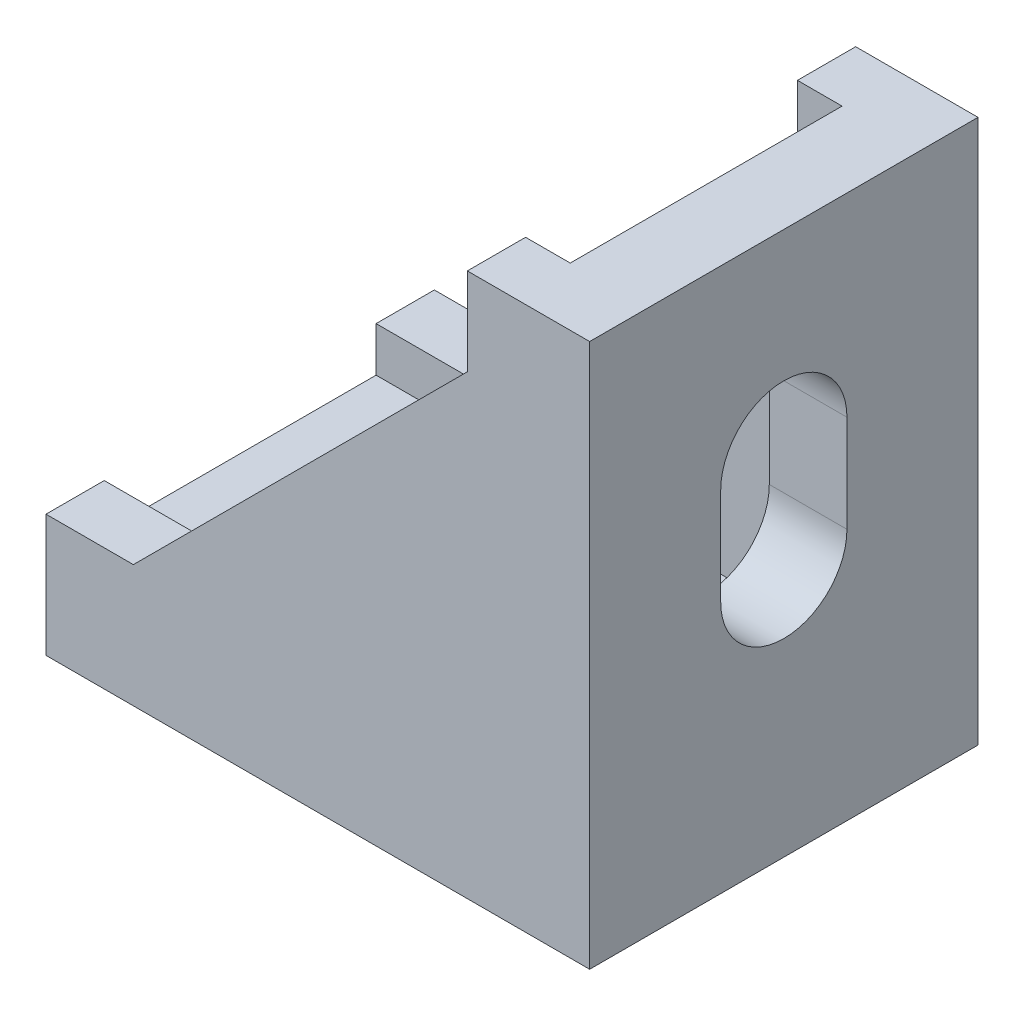
ISO-10303-21;
HEADER;
FILE_DESCRIPTION(('STEP AP214'),'2;1');
FILE_NAME('part.step','',(''),(''),'','','');
FILE_SCHEMA(('AUTOMOTIVE_DESIGN { 1 0 10303 214 1 1 1 1 }'));
ENDSEC;
DATA;
#1=APPLICATION_CONTEXT('core data for automotive mechanical design processes');
#2=APPLICATION_PROTOCOL_DEFINITION('international standard','automotive_design',2000,#1);
#3=PRODUCT_CONTEXT('',#1,'mechanical');
#4=PRODUCT('Part','Part','',(#3));
#5=PRODUCT_RELATED_PRODUCT_CATEGORY('part','',(#4));
#6=PRODUCT_DEFINITION_FORMATION('','',#4);
#7=PRODUCT_DEFINITION_CONTEXT('part definition',#1,'design');
#8=PRODUCT_DEFINITION('design','',#6,#7);
#9=PRODUCT_DEFINITION_SHAPE('','',#8);
#10=(LENGTH_UNIT() NAMED_UNIT(*) SI_UNIT(.MILLI.,.METRE.));
#11=(NAMED_UNIT(*) PLANE_ANGLE_UNIT() SI_UNIT($,.RADIAN.));
#12=(NAMED_UNIT(*) SI_UNIT($,.STERADIAN.) SOLID_ANGLE_UNIT());
#13=UNCERTAINTY_MEASURE_WITH_UNIT(LENGTH_MEASURE(1.E-05),#10,'distance_accuracy_value','');
#14=(GEOMETRIC_REPRESENTATION_CONTEXT(3) GLOBAL_UNCERTAINTY_ASSIGNED_CONTEXT((#13)) GLOBAL_UNIT_ASSIGNED_CONTEXT((#10,
#11,#12)) REPRESENTATION_CONTEXT('',''));
#15=CARTESIAN_POINT('',(0.,0.,0.));
#16=DIRECTION('',(0.,0.,1.));
#17=DIRECTION('',(1.,0.,0.));
#18=AXIS2_PLACEMENT_3D('',#15,#16,#17);
#19=CARTESIAN_POINT('',(10.,14.,20.));
#20=DIRECTION('',(1.,0.,0.));
#21=DIRECTION('',(0.,1.,0.));
#22=AXIS2_PLACEMENT_3D('',#19,#20,#21);
#23=PLANE('',#22);
#24=DIRECTION('',(0.,-1.,0.));
#25=VECTOR('',#24,1.);
#26=CARTESIAN_POINT('',(10.,4.00000000000001,6.75));
#27=LINE('',#26,#25);
#28=CARTESIAN_POINT('',(10.,4.00000000000001,6.75));
#29=VERTEX_POINT('',#28);
#30=CARTESIAN_POINT('',(10.,-0.999999999999995,6.75));
#31=VERTEX_POINT('',#30);
#32=EDGE_CURVE('E257',#29,#31,#27,.T.);
#33=ORIENTED_EDGE('',*,*,#32,.F.);
#34=CARTESIAN_POINT('',(10.,4.,10.));
#35=DIRECTION('',(-1.,0.,0.));
#36=DIRECTION('',(0.,-1.,0.));
#37=AXIS2_PLACEMENT_3D('',#34,#35,#36);
#38=CIRCLE('',#37,3.25);
#39=CARTESIAN_POINT('',(10.,4.,13.25));
#40=VERTEX_POINT('',#39);
#41=EDGE_CURVE('E231',#40,#29,#38,.T.);
#42=ORIENTED_EDGE('',*,*,#41,.F.);
#43=DIRECTION('',(0.,1.,0.));
#44=VECTOR('',#43,1.);
#45=CARTESIAN_POINT('',(10.,4.,13.25));
#46=LINE('',#45,#44);
#47=CARTESIAN_POINT('',(10.,-0.999999999999995,13.25));
#48=VERTEX_POINT('',#47);
#49=EDGE_CURVE('E242',#48,#40,#46,.T.);
#50=ORIENTED_EDGE('',*,*,#49,.F.);
#51=CARTESIAN_POINT('',(10.,-0.999999999999996,10.));
#52=DIRECTION('',(-1.,0.,0.));
#53=DIRECTION('',(0.,-1.,0.));
#54=AXIS2_PLACEMENT_3D('',#51,#52,#53);
#55=CIRCLE('',#54,3.25);
#56=EDGE_CURVE('E261',#31,#48,#55,.T.);
#57=ORIENTED_EDGE('',*,*,#56,.F.);
#58=EDGE_LOOP('',(#33,#42,#50,#57));
#59=FACE_BOUND('',#58,.T.);
#60=DIRECTION('',(0.,-1.,0.));
#61=VECTOR('',#60,1.);
#62=CARTESIAN_POINT('',(10.,14.,17.));
#63=LINE('',#62,#61);
#64=CARTESIAN_POINT('',(10.,14.,17.));
#65=VERTEX_POINT('',#64);
#66=CARTESIAN_POINT('',(10.,-10.,17.));
#67=VERTEX_POINT('',#66);
#68=EDGE_CURVE('E325',#65,#67,#63,.T.);
#69=ORIENTED_EDGE('',*,*,#68,.F.);
#70=DIRECTION('',(0.,0.,-1.));
#71=VECTOR('',#70,1.);
#72=CARTESIAN_POINT('',(10.,14.,20.));
#73=LINE('',#72,#71);
#74=CARTESIAN_POINT('',(10.,14.,3.));
#75=VERTEX_POINT('',#74);
#76=EDGE_CURVE('E48',#65,#75,#73,.T.);
#77=ORIENTED_EDGE('',*,*,#76,.T.);
#78=DIRECTION('',(0.,1.,0.));
#79=VECTOR('',#78,1.);
#80=CARTESIAN_POINT('',(10.,14.,3.));
#81=LINE('',#80,#79);
#82=CARTESIAN_POINT('',(10.,-10.,3.));
#83=VERTEX_POINT('',#82);
#84=EDGE_CURVE('E377',#83,#75,#81,.T.);
#85=ORIENTED_EDGE('',*,*,#84,.F.);
#86=DIRECTION('',(0.,0.,-1.));
#87=VECTOR('',#86,1.);
#88=CARTESIAN_POINT('',(10.,-10.,20.));
#89=LINE('',#88,#87);
#90=EDGE_CURVE('E418',#67,#83,#89,.T.);
#91=ORIENTED_EDGE('',*,*,#90,.F.);
#92=EDGE_LOOP('',(#69,#77,#85,#91));
#93=FACE_BOUND('',#92,.T.);
#94=ADVANCED_FACE('F39',(#59,#93),#23,.F.);
#95=CARTESIAN_POINT('',(10.,-10.,20.));
#96=DIRECTION('',(0.,-1.,0.));
#97=DIRECTION('',(1.,0.,0.));
#98=AXIS2_PLACEMENT_3D('',#95,#96,#97);
#99=PLANE('',#98);
#100=DIRECTION('',(1.,0.,0.));
#101=VECTOR('',#100,1.);
#102=CARTESIAN_POINT('',(-3.99999999999999,-10.,13.25));
#103=LINE('',#102,#101);
#104=CARTESIAN_POINT('',(-3.99999999999999,-10.,13.25));
#105=VERTEX_POINT('',#104);
#106=CARTESIAN_POINT('',(1.,-10.,13.25));
#107=VERTEX_POINT('',#106);
#108=EDGE_CURVE('E222',#105,#107,#103,.T.);
#109=ORIENTED_EDGE('',*,*,#108,.F.);
#110=CARTESIAN_POINT('',(-3.99999999999999,-10.,10.));
#111=DIRECTION('',(0.,1.,0.));
#112=DIRECTION('',(-1.,0.,0.));
#113=AXIS2_PLACEMENT_3D('',#110,#111,#112);
#114=CIRCLE('',#113,3.25);
#115=CARTESIAN_POINT('',(-3.99999999999999,-10.,6.75));
#116=VERTEX_POINT('',#115);
#117=EDGE_CURVE('E55',#116,#105,#114,.T.);
#118=ORIENTED_EDGE('',*,*,#117,.F.);
#119=DIRECTION('',(-1.,0.,0.));
#120=VECTOR('',#119,1.);
#121=CARTESIAN_POINT('',(-3.99999999999999,-10.,6.75));
#122=LINE('',#121,#120);
#123=CARTESIAN_POINT('',(1.00000000000001,-10.,6.75));
#124=VERTEX_POINT('',#123);
#125=EDGE_CURVE('E209',#124,#116,#122,.T.);
#126=ORIENTED_EDGE('',*,*,#125,.F.);
#127=CARTESIAN_POINT('',(1.00000000000001,-10.,10.));
#128=DIRECTION('',(0.,1.,0.));
#129=DIRECTION('',(-1.,0.,0.));
#130=AXIS2_PLACEMENT_3D('',#127,#128,#129);
#131=CIRCLE('',#130,3.25);
#132=EDGE_CURVE('E213',#107,#124,#131,.T.);
#133=ORIENTED_EDGE('',*,*,#132,.F.);
#134=EDGE_LOOP('',(#109,#118,#126,#133));
#135=FACE_BOUND('',#134,.T.);
#136=DIRECTION('',(-1.,0.,0.));
#137=VECTOR('',#136,1.);
#138=CARTESIAN_POINT('',(10.,-10.,17.));
#139=LINE('',#138,#137);
#140=CARTESIAN_POINT('',(-14.,-10.,17.));
#141=VERTEX_POINT('',#140);
#142=EDGE_CURVE('E311',#67,#141,#139,.T.);
#143=ORIENTED_EDGE('',*,*,#142,.F.);
#144=ORIENTED_EDGE('',*,*,#90,.T.);
#145=DIRECTION('',(1.,0.,0.));
#146=VECTOR('',#145,1.);
#147=CARTESIAN_POINT('',(10.,-10.,3.));
#148=LINE('',#147,#146);
#149=CARTESIAN_POINT('',(-14.,-10.,3.));
#150=VERTEX_POINT('',#149);
#151=EDGE_CURVE('E364',#150,#83,#148,.T.);
#152=ORIENTED_EDGE('',*,*,#151,.F.);
#153=DIRECTION('',(0.,0.,-1.));
#154=VECTOR('',#153,1.);
#155=CARTESIAN_POINT('',(-14.,-10.,20.));
#156=LINE('',#155,#154);
#157=EDGE_CURVE('E415',#141,#150,#156,.T.);
#158=ORIENTED_EDGE('',*,*,#157,.F.);
#159=EDGE_LOOP('',(#143,#144,#152,#158));
#160=FACE_BOUND('',#159,.T.);
#161=ADVANCED_FACE('F454',(#135,#160),#99,.F.);
#162=CARTESIAN_POINT('',(14.,-14.,20.));
#163=DIRECTION('',(-1.,0.,0.));
#164=DIRECTION('',(0.,0.,1.));
#165=AXIS2_PLACEMENT_3D('',#162,#163,#164);
#166=PLANE('',#165);
#167=DIRECTION('',(0.,1.,0.));
#168=VECTOR('',#167,1.);
#169=CARTESIAN_POINT('',(14.,4.,13.25));
#170=LINE('',#169,#168);
#171=CARTESIAN_POINT('',(14.,-0.999999999999994,13.25));
#172=VERTEX_POINT('',#171);
#173=CARTESIAN_POINT('',(14.,4.,13.25));
#174=VERTEX_POINT('',#173);
#175=EDGE_CURVE('E250',#172,#174,#170,.T.);
#176=ORIENTED_EDGE('',*,*,#175,.T.);
#177=CARTESIAN_POINT('',(14.,4.00000000000001,10.));
#178=DIRECTION('',(-1.,0.,0.));
#179=DIRECTION('',(0.,-1.,0.));
#180=AXIS2_PLACEMENT_3D('',#177,#178,#179);
#181=CIRCLE('',#180,3.25);
#182=CARTESIAN_POINT('',(14.,4.00000000000001,6.75));
#183=VERTEX_POINT('',#182);
#184=EDGE_CURVE('E237',#174,#183,#181,.T.);
#185=ORIENTED_EDGE('',*,*,#184,.T.);
#186=DIRECTION('',(0.,-1.,0.));
#187=VECTOR('',#186,1.);
#188=CARTESIAN_POINT('',(14.,4.00000000000001,6.75));
#189=LINE('',#188,#187);
#190=CARTESIAN_POINT('',(14.,-0.999999999999996,6.75));
#191=VERTEX_POINT('',#190);
#192=EDGE_CURVE('E241',#183,#191,#189,.T.);
#193=ORIENTED_EDGE('',*,*,#192,.T.);
#194=CARTESIAN_POINT('',(14.,-0.999999999999995,10.));
#195=DIRECTION('',(-1.,0.,0.));
#196=DIRECTION('',(0.,-1.,0.));
#197=AXIS2_PLACEMENT_3D('',#194,#195,#196);
#198=CIRCLE('',#197,3.25);
#199=EDGE_CURVE('E246',#191,#172,#198,.T.);
#200=ORIENTED_EDGE('',*,*,#199,.T.);
#201=EDGE_LOOP('',(#176,#185,#193,#200));
#202=FACE_BOUND('',#201,.T.);
#203=DIRECTION('',(0.,0.,-1.));
#204=VECTOR('',#203,1.);
#205=CARTESIAN_POINT('',(14.,-14.,20.));
#206=LINE('',#205,#204);
#207=CARTESIAN_POINT('',(14.,-14.,20.));
#208=VERTEX_POINT('',#207);
#209=CARTESIAN_POINT('',(14.,-14.,0.));
#210=VERTEX_POINT('',#209);
#211=EDGE_CURVE('E396',#208,#210,#206,.T.);
#212=ORIENTED_EDGE('',*,*,#211,.T.);
#213=DIRECTION('',(0.,1.,0.));
#214=VECTOR('',#213,1.);
#215=CARTESIAN_POINT('',(14.,-14.,0.));
#216=LINE('',#215,#214);
#217=CARTESIAN_POINT('',(14.,14.,0.));
#218=VERTEX_POINT('',#217);
#219=EDGE_CURVE('E381',#210,#218,#216,.T.);
#220=ORIENTED_EDGE('',*,*,#219,.T.);
#221=DIRECTION('',(0.,0.,-1.));
#222=VECTOR('',#221,1.);
#223=CARTESIAN_POINT('',(14.,14.,20.));
#224=LINE('',#223,#222);
#225=CARTESIAN_POINT('',(14.,14.,20.));
#226=VERTEX_POINT('',#225);
#227=EDGE_CURVE('E11',#226,#218,#224,.T.);
#228=ORIENTED_EDGE('',*,*,#227,.F.);
#229=DIRECTION('',(0.,1.,0.));
#230=VECTOR('',#229,1.);
#231=CARTESIAN_POINT('',(14.,-14.,20.));
#232=LINE('',#231,#230);
#233=EDGE_CURVE('E382',#208,#226,#232,.T.);
#234=ORIENTED_EDGE('',*,*,#233,.F.);
#235=EDGE_LOOP('',(#212,#220,#228,#234));
#236=FACE_BOUND('',#235,.T.);
#237=ADVANCED_FACE('F41',(#202,#236),#166,.F.);
#238=CARTESIAN_POINT('',(14.,14.,20.));
#239=DIRECTION('',(0.,-1.,0.));
#240=DIRECTION('',(1.,0.,0.));
#241=AXIS2_PLACEMENT_3D('',#238,#239,#240);
#242=PLANE('',#241);
#243=ORIENTED_EDGE('',*,*,#227,.T.);
#244=DIRECTION('',(-1.,0.,0.));
#245=VECTOR('',#244,1.);
#246=CARTESIAN_POINT('',(14.,14.,0.));
#247=LINE('',#246,#245);
#248=CARTESIAN_POINT('',(7.7,14.,0.));
#249=VERTEX_POINT('',#248);
#250=EDGE_CURVE('E400',#218,#249,#247,.T.);
#251=ORIENTED_EDGE('',*,*,#250,.T.);
#252=DIRECTION('',(0.,0.,-1.));
#253=VECTOR('',#252,1.);
#254=CARTESIAN_POINT('',(7.7,14.,3.));
#255=LINE('',#254,#253);
#256=CARTESIAN_POINT('',(7.7,14.,3.));
#257=VERTEX_POINT('',#256);
#258=EDGE_CURVE('E360',#257,#249,#255,.T.);
#259=ORIENTED_EDGE('',*,*,#258,.F.);
#260=DIRECTION('',(1.,0.,0.));
#261=VECTOR('',#260,1.);
#262=CARTESIAN_POINT('',(10.,14.,3.));
#263=LINE('',#262,#261);
#264=EDGE_CURVE('E329',#257,#75,#263,.T.);
#265=ORIENTED_EDGE('',*,*,#264,.T.);
#266=ORIENTED_EDGE('',*,*,#76,.F.);
#267=DIRECTION('',(1.,0.,0.));
#268=VECTOR('',#267,1.);
#269=CARTESIAN_POINT('',(10.,14.,17.));
#270=LINE('',#269,#268);
#271=CARTESIAN_POINT('',(7.7,14.,17.));
#272=VERTEX_POINT('',#271);
#273=EDGE_CURVE('E281',#272,#65,#270,.T.);
#274=ORIENTED_EDGE('',*,*,#273,.F.);
#275=DIRECTION('',(0.,0.,1.));
#276=VECTOR('',#275,1.);
#277=CARTESIAN_POINT('',(7.7,14.,17.));
#278=LINE('',#277,#276);
#279=CARTESIAN_POINT('',(7.7,14.,20.));
#280=VERTEX_POINT('',#279);
#281=EDGE_CURVE('E298',#272,#280,#278,.T.);
#282=ORIENTED_EDGE('',*,*,#281,.T.);
#283=DIRECTION('',(-1.,0.,0.));
#284=VECTOR('',#283,1.);
#285=CARTESIAN_POINT('',(14.,14.,20.));
#286=LINE('',#285,#284);
#287=EDGE_CURVE('E386',#226,#280,#286,.T.);
#288=ORIENTED_EDGE('',*,*,#287,.F.);
#289=EDGE_LOOP('',(#243,#251,#259,#265,#266,#274,#282,#288));
#290=FACE_BOUND('',#289,.T.);
#291=ADVANCED_FACE('F433',(#290),#242,.F.);
#292=CARTESIAN_POINT('',(-14.,-14.,20.));
#293=DIRECTION('',(1.,0.,0.));
#294=DIRECTION('',(0.,0.,-1.));
#295=AXIS2_PLACEMENT_3D('',#292,#293,#294);
#296=PLANE('',#295);
#297=DIRECTION('',(0.,-1.,0.));
#298=VECTOR('',#297,1.);
#299=CARTESIAN_POINT('',(-14.,-14.,20.));
#300=LINE('',#299,#298);
#301=CARTESIAN_POINT('',(-14.,-7.7,20.));
#302=VERTEX_POINT('',#301);
#303=CARTESIAN_POINT('',(-14.,-14.,20.));
#304=VERTEX_POINT('',#303);
#305=EDGE_CURVE('E390',#302,#304,#300,.T.);
#306=ORIENTED_EDGE('',*,*,#305,.F.);
#307=DIRECTION('',(0.,0.,1.));
#308=VECTOR('',#307,1.);
#309=CARTESIAN_POINT('',(-14.,-7.7,17.));
#310=LINE('',#309,#308);
#311=CARTESIAN_POINT('',(-14.,-7.7,17.));
#312=VERTEX_POINT('',#311);
#313=EDGE_CURVE('E307',#312,#302,#310,.T.);
#314=ORIENTED_EDGE('',*,*,#313,.F.);
#315=DIRECTION('',(0.,1.,0.));
#316=VECTOR('',#315,1.);
#317=CARTESIAN_POINT('',(-14.,-7.7,17.));
#318=LINE('',#317,#316);
#319=EDGE_CURVE('E295',#141,#312,#318,.T.);
#320=ORIENTED_EDGE('',*,*,#319,.F.);
#321=ORIENTED_EDGE('',*,*,#157,.T.);
#322=DIRECTION('',(0.,1.,0.));
#323=VECTOR('',#322,1.);
#324=CARTESIAN_POINT('',(-14.,-14.,3.));
#325=LINE('',#324,#323);
#326=CARTESIAN_POINT('',(-14.,-7.7,3.));
#327=VERTEX_POINT('',#326);
#328=EDGE_CURVE('E333',#150,#327,#325,.T.);
#329=ORIENTED_EDGE('',*,*,#328,.T.);
#330=DIRECTION('',(0.,0.,-1.));
#331=VECTOR('',#330,1.);
#332=CARTESIAN_POINT('',(-14.,-7.7,3.));
#333=LINE('',#332,#331);
#334=CARTESIAN_POINT('',(-14.,-7.7,0.));
#335=VERTEX_POINT('',#334);
#336=EDGE_CURVE('E349',#327,#335,#333,.T.);
#337=ORIENTED_EDGE('',*,*,#336,.T.);
#338=DIRECTION('',(0.,-1.,0.));
#339=VECTOR('',#338,1.);
#340=CARTESIAN_POINT('',(-14.,-14.,0.));
#341=LINE('',#340,#339);
#342=CARTESIAN_POINT('',(-14.,-14.,0.));
#343=VERTEX_POINT('',#342);
#344=EDGE_CURVE('E403',#335,#343,#341,.T.);
#345=ORIENTED_EDGE('',*,*,#344,.T.);
#346=DIRECTION('',(0.,0.,-1.));
#347=VECTOR('',#346,1.);
#348=CARTESIAN_POINT('',(-14.,-14.,20.));
#349=LINE('',#348,#347);
#350=EDGE_CURVE('E412',#304,#343,#349,.T.);
#351=ORIENTED_EDGE('',*,*,#350,.F.);
#352=EDGE_LOOP('',(#306,#314,#320,#321,#329,#337,#345,#351));
#353=FACE_BOUND('',#352,.T.);
#354=ADVANCED_FACE('F448',(#353),#296,.F.);
#355=CARTESIAN_POINT('',(14.,-14.,20.));
#356=DIRECTION('',(0.,1.,0.));
#357=DIRECTION('',(0.,0.,1.));
#358=AXIS2_PLACEMENT_3D('',#355,#356,#357);
#359=PLANE('',#358);
#360=DIRECTION('',(-1.,0.,0.));
#361=VECTOR('',#360,1.);
#362=CARTESIAN_POINT('',(-3.99999999999999,-14.,6.75));
#363=LINE('',#362,#361);
#364=CARTESIAN_POINT('',(1.00000000000001,-14.,6.75));
#365=VERTEX_POINT('',#364);
#366=CARTESIAN_POINT('',(-3.99999999999999,-14.,6.75));
#367=VERTEX_POINT('',#366);
#368=EDGE_CURVE('E197',#365,#367,#363,.T.);
#369=ORIENTED_EDGE('',*,*,#368,.T.);
#370=CARTESIAN_POINT('',(-3.99999999999999,-14.,10.));
#371=DIRECTION('',(0.,1.,0.));
#372=DIRECTION('',(-1.,0.,0.));
#373=AXIS2_PLACEMENT_3D('',#370,#371,#372);
#374=CIRCLE('',#373,3.25);
#375=CARTESIAN_POINT('',(-3.99999999999999,-14.,13.25));
#376=VERTEX_POINT('',#375);
#377=EDGE_CURVE('E190',#367,#376,#374,.T.);
#378=ORIENTED_EDGE('',*,*,#377,.T.);
#379=DIRECTION('',(1.,0.,0.));
#380=VECTOR('',#379,1.);
#381=CARTESIAN_POINT('',(-3.99999999999999,-14.,13.25));
#382=LINE('',#381,#380);
#383=CARTESIAN_POINT('',(1.,-14.,13.25));
#384=VERTEX_POINT('',#383);
#385=EDGE_CURVE('E200',#376,#384,#382,.T.);
#386=ORIENTED_EDGE('',*,*,#385,.T.);
#387=CARTESIAN_POINT('',(1.00000000000001,-14.,10.));
#388=DIRECTION('',(0.,1.,0.));
#389=DIRECTION('',(-1.,0.,0.));
#390=AXIS2_PLACEMENT_3D('',#387,#388,#389);
#391=CIRCLE('',#390,3.25);
#392=EDGE_CURVE('E63',#384,#365,#391,.T.);
#393=ORIENTED_EDGE('',*,*,#392,.T.);
#394=EDGE_LOOP('',(#369,#378,#386,#393));
#395=FACE_BOUND('',#394,.T.);
#396=ORIENTED_EDGE('',*,*,#350,.T.);
#397=DIRECTION('',(1.,0.,0.));
#398=VECTOR('',#397,1.);
#399=CARTESIAN_POINT('',(14.,-14.,0.));
#400=LINE('',#399,#398);
#401=EDGE_CURVE('E387',#343,#210,#400,.T.);
#402=ORIENTED_EDGE('',*,*,#401,.T.);
#403=ORIENTED_EDGE('',*,*,#211,.F.);
#404=DIRECTION('',(1.,0.,0.));
#405=VECTOR('',#404,1.);
#406=CARTESIAN_POINT('',(14.,-14.,20.));
#407=LINE('',#406,#405);
#408=EDGE_CURVE('E393',#304,#208,#407,.T.);
#409=ORIENTED_EDGE('',*,*,#408,.F.);
#410=EDGE_LOOP('',(#396,#402,#403,#409));
#411=FACE_BOUND('',#410,.T.);
#412=ADVANCED_FACE('F205',(#395,#411),#359,.F.);
#413=CARTESIAN_POINT('',(0.,0.,20.));
#414=DIRECTION('',(0.,0.,1.));
#415=DIRECTION('',(1.,0.,0.));
#416=AXIS2_PLACEMENT_3D('',#413,#414,#415);
#417=PLANE('',#416);
#418=ORIENTED_EDGE('',*,*,#233,.T.);
#419=ORIENTED_EDGE('',*,*,#287,.T.);
#420=DIRECTION('',(0.,1.,0.));
#421=VECTOR('',#420,1.);
#422=CARTESIAN_POINT('',(7.7,14.,20.));
#423=LINE('',#422,#421);
#424=CARTESIAN_POINT('',(7.7,9.49999999999999,20.));
#425=VERTEX_POINT('',#424);
#426=EDGE_CURVE('E271',#425,#280,#423,.T.);
#427=ORIENTED_EDGE('',*,*,#426,.F.);
#428=DIRECTION('',(0.707106781186548,0.707106781186547,0.));
#429=VECTOR('',#428,1.);
#430=CARTESIAN_POINT('',(7.7,9.49999999999999,20.));
#431=LINE('',#430,#429);
#432=CARTESIAN_POINT('',(-9.5,-7.7,20.));
#433=VERTEX_POINT('',#432);
#434=EDGE_CURVE('E302',#433,#425,#431,.T.);
#435=ORIENTED_EDGE('',*,*,#434,.F.);
#436=DIRECTION('',(1.,0.,0.));
#437=VECTOR('',#436,1.);
#438=CARTESIAN_POINT('',(-9.5,-7.7,20.));
#439=LINE('',#438,#437);
#440=EDGE_CURVE('E285',#302,#433,#439,.T.);
#441=ORIENTED_EDGE('',*,*,#440,.F.);
#442=ORIENTED_EDGE('',*,*,#305,.T.);
#443=ORIENTED_EDGE('',*,*,#408,.T.);
#444=EDGE_LOOP('',(#418,#419,#427,#435,#441,#442,#443));
#445=FACE_BOUND('',#444,.T.);
#446=ADVANCED_FACE('F465',(#445),#417,.T.);
#447=CARTESIAN_POINT('',(0.,0.,0.));
#448=DIRECTION('',(0.,0.,1.));
#449=DIRECTION('',(1.,0.,0.));
#450=AXIS2_PLACEMENT_3D('',#447,#448,#449);
#451=PLANE('',#450);
#452=ORIENTED_EDGE('',*,*,#219,.F.);
#453=ORIENTED_EDGE('',*,*,#401,.F.);
#454=ORIENTED_EDGE('',*,*,#344,.F.);
#455=DIRECTION('',(1.,0.,0.));
#456=VECTOR('',#455,1.);
#457=CARTESIAN_POINT('',(-9.5,-7.7,0.));
#458=LINE('',#457,#456);
#459=CARTESIAN_POINT('',(-9.5,-7.7,0.));
#460=VERTEX_POINT('',#459);
#461=EDGE_CURVE('E328',#335,#460,#458,.T.);
#462=ORIENTED_EDGE('',*,*,#461,.T.);
#463=DIRECTION('',(0.707106781186548,0.707106781186547,0.));
#464=VECTOR('',#463,1.);
#465=CARTESIAN_POINT('',(7.7,9.49999999999999,0.));
#466=LINE('',#465,#464);
#467=CARTESIAN_POINT('',(7.7,9.49999999999999,0.));
#468=VERTEX_POINT('',#467);
#469=EDGE_CURVE('E353',#460,#468,#466,.T.);
#470=ORIENTED_EDGE('',*,*,#469,.T.);
#471=DIRECTION('',(0.,1.,0.));
#472=VECTOR('',#471,1.);
#473=CARTESIAN_POINT('',(7.7,14.,0.));
#474=LINE('',#473,#472);
#475=EDGE_CURVE('E334',#468,#249,#474,.T.);
#476=ORIENTED_EDGE('',*,*,#475,.T.);
#477=ORIENTED_EDGE('',*,*,#250,.F.);
#478=EDGE_LOOP('',(#452,#453,#454,#462,#470,#476,#477));
#479=FACE_BOUND('',#478,.T.);
#480=ADVANCED_FACE('F474',(#479),#451,.F.);
#481=CARTESIAN_POINT('',(0.,0.,3.));
#482=DIRECTION('',(0.,0.,-1.));
#483=DIRECTION('',(-1.,0.,0.));
#484=AXIS2_PLACEMENT_3D('',#481,#482,#483);
#485=PLANE('',#484);
#486=ORIENTED_EDGE('',*,*,#151,.T.);
#487=ORIENTED_EDGE('',*,*,#84,.T.);
#488=ORIENTED_EDGE('',*,*,#264,.F.);
#489=DIRECTION('',(0.,1.,0.));
#490=VECTOR('',#489,1.);
#491=CARTESIAN_POINT('',(7.7,14.,3.));
#492=LINE('',#491,#490);
#493=CARTESIAN_POINT('',(7.7,9.49999999999999,3.));
#494=VERTEX_POINT('',#493);
#495=EDGE_CURVE('E345',#494,#257,#492,.T.);
#496=ORIENTED_EDGE('',*,*,#495,.F.);
#497=DIRECTION('',(0.707106781186548,0.707106781186547,0.));
#498=VECTOR('',#497,1.);
#499=CARTESIAN_POINT('',(7.7,9.49999999999999,3.));
#500=LINE('',#499,#498);
#501=CARTESIAN_POINT('',(-9.5,-7.7,3.));
#502=VERTEX_POINT('',#501);
#503=EDGE_CURVE('E341',#502,#494,#500,.T.);
#504=ORIENTED_EDGE('',*,*,#503,.F.);
#505=DIRECTION('',(1.,0.,0.));
#506=VECTOR('',#505,1.);
#507=CARTESIAN_POINT('',(-9.5,-7.7,3.));
#508=LINE('',#507,#506);
#509=EDGE_CURVE('E337',#327,#502,#508,.T.);
#510=ORIENTED_EDGE('',*,*,#509,.F.);
#511=ORIENTED_EDGE('',*,*,#328,.F.);
#512=EDGE_LOOP('',(#486,#487,#488,#496,#504,#510,#511));
#513=FACE_BOUND('',#512,.T.);
#514=ADVANCED_FACE('F428',(#513),#485,.F.);
#515=CARTESIAN_POINT('',(7.7,14.,3.));
#516=DIRECTION('',(-1.,0.,0.));
#517=DIRECTION('',(0.,-1.,0.));
#518=AXIS2_PLACEMENT_3D('',#515,#516,#517);
#519=PLANE('',#518);
#520=ORIENTED_EDGE('',*,*,#475,.F.);
#521=DIRECTION('',(0.,0.,-1.));
#522=VECTOR('',#521,1.);
#523=CARTESIAN_POINT('',(7.7,9.49999999999999,3.));
#524=LINE('',#523,#522);
#525=EDGE_CURVE('E365',#494,#468,#524,.T.);
#526=ORIENTED_EDGE('',*,*,#525,.F.);
#527=ORIENTED_EDGE('',*,*,#495,.T.);
#528=ORIENTED_EDGE('',*,*,#258,.T.);
#529=EDGE_LOOP('',(#520,#526,#527,#528));
#530=FACE_BOUND('',#529,.T.);
#531=ADVANCED_FACE('F437',(#530),#519,.T.);
#532=CARTESIAN_POINT('',(7.7,9.49999999999999,3.));
#533=DIRECTION('',(-0.707106781186547,0.707106781186548,0.));
#534=DIRECTION('',(-0.707106781186548,-0.707106781186547,0.));
#535=AXIS2_PLACEMENT_3D('',#532,#533,#534);
#536=PLANE('',#535);
#537=ORIENTED_EDGE('',*,*,#469,.F.);
#538=DIRECTION('',(0.,0.,-1.));
#539=VECTOR('',#538,1.);
#540=CARTESIAN_POINT('',(-9.5,-7.7,3.));
#541=LINE('',#540,#539);
#542=EDGE_CURVE('E368',#502,#460,#541,.T.);
#543=ORIENTED_EDGE('',*,*,#542,.F.);
#544=ORIENTED_EDGE('',*,*,#503,.T.);
#545=ORIENTED_EDGE('',*,*,#525,.T.);
#546=EDGE_LOOP('',(#537,#543,#544,#545));
#547=FACE_BOUND('',#546,.T.);
#548=ADVANCED_FACE('F442',(#547),#536,.T.);
#549=CARTESIAN_POINT('',(-9.5,-7.7,3.));
#550=DIRECTION('',(0.,1.,0.));
#551=DIRECTION('',(0.,0.,1.));
#552=AXIS2_PLACEMENT_3D('',#549,#550,#551);
#553=PLANE('',#552);
#554=ORIENTED_EDGE('',*,*,#461,.F.);
#555=ORIENTED_EDGE('',*,*,#336,.F.);
#556=ORIENTED_EDGE('',*,*,#509,.T.);
#557=ORIENTED_EDGE('',*,*,#542,.T.);
#558=EDGE_LOOP('',(#554,#555,#556,#557));
#559=FACE_BOUND('',#558,.T.);
#560=ADVANCED_FACE('F445',(#559),#553,.T.);
#561=CARTESIAN_POINT('',(0.,0.,17.));
#562=DIRECTION('',(0.,0.,1.));
#563=DIRECTION('',(-1.,0.,0.));
#564=AXIS2_PLACEMENT_3D('',#561,#562,#563);
#565=PLANE('',#564);
#566=ORIENTED_EDGE('',*,*,#273,.T.);
#567=ORIENTED_EDGE('',*,*,#68,.T.);
#568=ORIENTED_EDGE('',*,*,#142,.T.);
#569=ORIENTED_EDGE('',*,*,#319,.T.);
#570=DIRECTION('',(1.,0.,0.));
#571=VECTOR('',#570,1.);
#572=CARTESIAN_POINT('',(-9.5,-7.7,17.));
#573=LINE('',#572,#571);
#574=CARTESIAN_POINT('',(-9.5,-7.7,17.));
#575=VERTEX_POINT('',#574);
#576=EDGE_CURVE('E292',#312,#575,#573,.T.);
#577=ORIENTED_EDGE('',*,*,#576,.T.);
#578=DIRECTION('',(0.707106781186548,0.707106781186547,0.));
#579=VECTOR('',#578,1.);
#580=CARTESIAN_POINT('',(7.7,9.49999999999999,17.));
#581=LINE('',#580,#579);
#582=CARTESIAN_POINT('',(7.7,9.49999999999999,17.));
#583=VERTEX_POINT('',#582);
#584=EDGE_CURVE('E289',#575,#583,#581,.T.);
#585=ORIENTED_EDGE('',*,*,#584,.T.);
#586=DIRECTION('',(0.,1.,0.));
#587=VECTOR('',#586,1.);
#588=CARTESIAN_POINT('',(7.7,14.,17.));
#589=LINE('',#588,#587);
#590=EDGE_CURVE('E284',#583,#272,#589,.T.);
#591=ORIENTED_EDGE('',*,*,#590,.T.);
#592=EDGE_LOOP('',(#566,#567,#568,#569,#577,#585,#591));
#593=FACE_BOUND('',#592,.T.);
#594=ADVANCED_FACE('F456',(#593),#565,.F.);
#595=CARTESIAN_POINT('',(-9.5,-7.7,17.));
#596=DIRECTION('',(0.,-1.,0.));
#597=DIRECTION('',(0.,0.,-1.));
#598=AXIS2_PLACEMENT_3D('',#595,#596,#597);
#599=PLANE('',#598);
#600=ORIENTED_EDGE('',*,*,#440,.T.);
#601=DIRECTION('',(0.,0.,1.));
#602=VECTOR('',#601,1.);
#603=CARTESIAN_POINT('',(-9.5,-7.7,17.));
#604=LINE('',#603,#602);
#605=EDGE_CURVE('E312',#575,#433,#604,.T.);
#606=ORIENTED_EDGE('',*,*,#605,.F.);
#607=ORIENTED_EDGE('',*,*,#576,.F.);
#608=ORIENTED_EDGE('',*,*,#313,.T.);
#609=EDGE_LOOP('',(#600,#606,#607,#608));
#610=FACE_BOUND('',#609,.T.);
#611=ADVANCED_FACE('F531',(#610),#599,.F.);
#612=CARTESIAN_POINT('',(7.7,9.49999999999999,17.));
#613=DIRECTION('',(0.707106781186547,-0.707106781186548,0.));
#614=DIRECTION('',(0.707106781186548,0.707106781186547,0.));
#615=AXIS2_PLACEMENT_3D('',#612,#613,#614);
#616=PLANE('',#615);
#617=ORIENTED_EDGE('',*,*,#434,.T.);
#618=DIRECTION('',(0.,0.,1.));
#619=VECTOR('',#618,1.);
#620=CARTESIAN_POINT('',(7.7,9.49999999999999,17.));
#621=LINE('',#620,#619);
#622=EDGE_CURVE('E316',#583,#425,#621,.T.);
#623=ORIENTED_EDGE('',*,*,#622,.F.);
#624=ORIENTED_EDGE('',*,*,#584,.F.);
#625=ORIENTED_EDGE('',*,*,#605,.T.);
#626=EDGE_LOOP('',(#617,#623,#624,#625));
#627=FACE_BOUND('',#626,.T.);
#628=ADVANCED_FACE('F534',(#627),#616,.F.);
#629=CARTESIAN_POINT('',(7.7,14.,17.));
#630=DIRECTION('',(1.,0.,0.));
#631=DIRECTION('',(0.,1.,0.));
#632=AXIS2_PLACEMENT_3D('',#629,#630,#631);
#633=PLANE('',#632);
#634=ORIENTED_EDGE('',*,*,#426,.T.);
#635=ORIENTED_EDGE('',*,*,#281,.F.);
#636=ORIENTED_EDGE('',*,*,#590,.F.);
#637=ORIENTED_EDGE('',*,*,#622,.T.);
#638=EDGE_LOOP('',(#634,#635,#636,#637));
#639=FACE_BOUND('',#638,.T.);
#640=ADVANCED_FACE('F460',(#639),#633,.F.);
#641=CARTESIAN_POINT('',(14.,4.00000000000001,10.));
#642=DIRECTION('',(-1.,0.,0.));
#643=DIRECTION('',(0.,-1.,0.));
#644=AXIS2_PLACEMENT_3D('',#641,#642,#643);
#645=CYLINDRICAL_SURFACE('',#644,3.25);
#646=ORIENTED_EDGE('',*,*,#41,.T.);
#647=DIRECTION('',(-1.,0.,0.));
#648=VECTOR('',#647,1.);
#649=CARTESIAN_POINT('',(14.,4.00000000000001,6.75));
#650=LINE('',#649,#648);
#651=EDGE_CURVE('E254',#183,#29,#650,.T.);
#652=ORIENTED_EDGE('',*,*,#651,.F.);
#653=ORIENTED_EDGE('',*,*,#184,.F.);
#654=DIRECTION('',(-1.,0.,0.));
#655=VECTOR('',#654,1.);
#656=CARTESIAN_POINT('',(14.,4.,13.25));
#657=LINE('',#656,#655);
#658=EDGE_CURVE('E268',#174,#40,#657,.T.);
#659=ORIENTED_EDGE('',*,*,#658,.T.);
#660=EDGE_LOOP('',(#646,#652,#653,#659));
#661=FACE_BOUND('',#660,.T.);
#662=ADVANCED_FACE('F509',(#661),#645,.F.);
#663=CARTESIAN_POINT('',(14.,4.,13.25));
#664=DIRECTION('',(0.,0.,1.));
#665=DIRECTION('',(0.,-1.,0.));
#666=AXIS2_PLACEMENT_3D('',#663,#664,#665);
#667=PLANE('',#666);
#668=ORIENTED_EDGE('',*,*,#49,.T.);
#669=ORIENTED_EDGE('',*,*,#658,.F.);
#670=ORIENTED_EDGE('',*,*,#175,.F.);
#671=DIRECTION('',(-1.,0.,0.));
#672=VECTOR('',#671,1.);
#673=CARTESIAN_POINT('',(14.,-0.999999999999994,13.25));
#674=LINE('',#673,#672);
#675=EDGE_CURVE('E272',#172,#48,#674,.T.);
#676=ORIENTED_EDGE('',*,*,#675,.T.);
#677=EDGE_LOOP('',(#668,#669,#670,#676));
#678=FACE_BOUND('',#677,.T.);
#679=ADVANCED_FACE('F505',(#678),#667,.F.);
#680=CARTESIAN_POINT('',(14.,-0.999999999999995,10.));
#681=DIRECTION('',(-1.,0.,0.));
#682=DIRECTION('',(0.,-1.,0.));
#683=AXIS2_PLACEMENT_3D('',#680,#681,#682);
#684=CYLINDRICAL_SURFACE('',#683,3.25);
#685=ORIENTED_EDGE('',*,*,#56,.T.);
#686=ORIENTED_EDGE('',*,*,#675,.F.);
#687=ORIENTED_EDGE('',*,*,#199,.F.);
#688=DIRECTION('',(-1.,0.,0.));
#689=VECTOR('',#688,1.);
#690=CARTESIAN_POINT('',(14.,-0.999999999999995,6.75));
#691=LINE('',#690,#689);
#692=EDGE_CURVE('E275',#191,#31,#691,.T.);
#693=ORIENTED_EDGE('',*,*,#692,.T.);
#694=EDGE_LOOP('',(#685,#686,#687,#693));
#695=FACE_BOUND('',#694,.T.);
#696=ADVANCED_FACE('F516',(#695),#684,.F.);
#697=CARTESIAN_POINT('',(14.,4.00000000000001,6.75));
#698=DIRECTION('',(0.,0.,-1.));
#699=DIRECTION('',(0.,1.,0.));
#700=AXIS2_PLACEMENT_3D('',#697,#698,#699);
#701=PLANE('',#700);
#702=ORIENTED_EDGE('',*,*,#32,.T.);
#703=ORIENTED_EDGE('',*,*,#692,.F.);
#704=ORIENTED_EDGE('',*,*,#192,.F.);
#705=ORIENTED_EDGE('',*,*,#651,.T.);
#706=EDGE_LOOP('',(#702,#703,#704,#705));
#707=FACE_BOUND('',#706,.T.);
#708=ADVANCED_FACE('F513',(#707),#701,.F.);
#709=CARTESIAN_POINT('',(-3.99999999999999,-14.,10.));
#710=DIRECTION('',(0.,1.,0.));
#711=DIRECTION('',(-1.,0.,0.));
#712=AXIS2_PLACEMENT_3D('',#709,#710,#711);
#713=CYLINDRICAL_SURFACE('',#712,3.25);
#714=ORIENTED_EDGE('',*,*,#117,.T.);
#715=DIRECTION('',(0.,1.,0.));
#716=VECTOR('',#715,1.);
#717=CARTESIAN_POINT('',(-3.99999999999999,-14.,13.25));
#718=LINE('',#717,#716);
#719=EDGE_CURVE('E186',#376,#105,#718,.T.);
#720=ORIENTED_EDGE('',*,*,#719,.F.);
#721=ORIENTED_EDGE('',*,*,#377,.F.);
#722=DIRECTION('',(0.,1.,0.));
#723=VECTOR('',#722,1.);
#724=CARTESIAN_POINT('',(-3.99999999999999,-14.,6.75));
#725=LINE('',#724,#723);
#726=EDGE_CURVE('E228',#367,#116,#725,.T.);
#727=ORIENTED_EDGE('',*,*,#726,.T.);
#728=EDGE_LOOP('',(#714,#720,#721,#727));
#729=FACE_BOUND('',#728,.T.);
#730=ADVANCED_FACE('F188',(#729),#713,.F.);
#731=CARTESIAN_POINT('',(-3.99999999999999,-14.,6.75));
#732=DIRECTION('',(0.,0.,-1.));
#733=DIRECTION('',(-1.,0.,0.));
#734=AXIS2_PLACEMENT_3D('',#731,#732,#733);
#735=PLANE('',#734);
#736=ORIENTED_EDGE('',*,*,#125,.T.);
#737=ORIENTED_EDGE('',*,*,#726,.F.);
#738=ORIENTED_EDGE('',*,*,#368,.F.);
#739=DIRECTION('',(0.,1.,0.));
#740=VECTOR('',#739,1.);
#741=CARTESIAN_POINT('',(1.00000000000001,-14.,6.75));
#742=LINE('',#741,#740);
#743=EDGE_CURVE('E232',#365,#124,#742,.T.);
#744=ORIENTED_EDGE('',*,*,#743,.T.);
#745=EDGE_LOOP('',(#736,#737,#738,#744));
#746=FACE_BOUND('',#745,.T.);
#747=ADVANCED_FACE('F625',(#746),#735,.F.);
#748=CARTESIAN_POINT('',(1.00000000000001,-14.,10.));
#749=DIRECTION('',(0.,1.,0.));
#750=DIRECTION('',(-1.,0.,0.));
#751=AXIS2_PLACEMENT_3D('',#748,#749,#750);
#752=CYLINDRICAL_SURFACE('',#751,3.25);
#753=ORIENTED_EDGE('',*,*,#132,.T.);
#754=ORIENTED_EDGE('',*,*,#743,.F.);
#755=ORIENTED_EDGE('',*,*,#392,.F.);
#756=DIRECTION('',(0.,1.,0.));
#757=VECTOR('',#756,1.);
#758=CARTESIAN_POINT('',(1.00000000000001,-14.,13.25));
#759=LINE('',#758,#757);
#760=EDGE_CURVE('E196',#384,#107,#759,.T.);
#761=ORIENTED_EDGE('',*,*,#760,.T.);
#762=EDGE_LOOP('',(#753,#754,#755,#761));
#763=FACE_BOUND('',#762,.T.);
#764=ADVANCED_FACE('F633',(#763),#752,.F.);
#765=CARTESIAN_POINT('',(-3.99999999999999,-14.,13.25));
#766=DIRECTION('',(0.,0.,1.));
#767=DIRECTION('',(1.,0.,0.));
#768=AXIS2_PLACEMENT_3D('',#765,#766,#767);
#769=PLANE('',#768);
#770=ORIENTED_EDGE('',*,*,#108,.T.);
#771=ORIENTED_EDGE('',*,*,#760,.F.);
#772=ORIENTED_EDGE('',*,*,#385,.F.);
#773=ORIENTED_EDGE('',*,*,#719,.T.);
#774=EDGE_LOOP('',(#770,#771,#772,#773));
#775=FACE_BOUND('',#774,.T.);
#776=ADVANCED_FACE('F201',(#775),#769,.F.);
#777=CLOSED_SHELL('',(#94,#161,#237,#291,#354,#412,#446,#480,#514,#531,#548,#560,#594,#611,#628,
#640,#662,#679,#696,#708,#730,#747,#764,#776));
#778=MANIFOLD_SOLID_BREP('B2',#777);
#779=ADVANCED_BREP_SHAPE_REPRESENTATION('',(#18,#778),#14);
#780=SHAPE_DEFINITION_REPRESENTATION(#9,#779);
ENDSEC;
END-ISO-10303-21;
